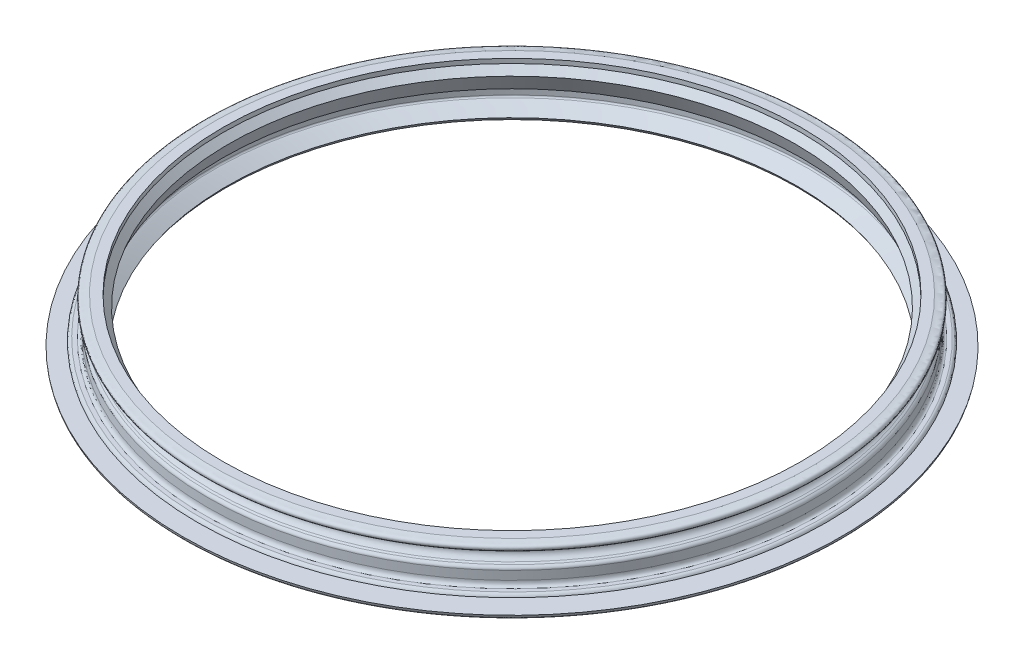
ISO-10303-21;
HEADER;
FILE_DESCRIPTION(('STEP AP214'),'2;1');
FILE_NAME('part.step','',(''),(''),'','','');
FILE_SCHEMA(('AUTOMOTIVE_DESIGN { 1 0 10303 214 1 1 1 1 }'));
ENDSEC;
DATA;
#1=APPLICATION_CONTEXT('core data for automotive mechanical design processes');
#2=APPLICATION_PROTOCOL_DEFINITION('international standard','automotive_design',2000,#1);
#3=PRODUCT_CONTEXT('',#1,'mechanical');
#4=PRODUCT('Part','Part','',(#3));
#5=PRODUCT_RELATED_PRODUCT_CATEGORY('part','',(#4));
#6=PRODUCT_DEFINITION_FORMATION('','',#4);
#7=PRODUCT_DEFINITION_CONTEXT('part definition',#1,'design');
#8=PRODUCT_DEFINITION('design','',#6,#7);
#9=PRODUCT_DEFINITION_SHAPE('','',#8);
#10=(LENGTH_UNIT() NAMED_UNIT(*) SI_UNIT(.MILLI.,.METRE.));
#11=(NAMED_UNIT(*) PLANE_ANGLE_UNIT() SI_UNIT($,.RADIAN.));
#12=(NAMED_UNIT(*) SI_UNIT($,.STERADIAN.) SOLID_ANGLE_UNIT());
#13=UNCERTAINTY_MEASURE_WITH_UNIT(LENGTH_MEASURE(1.E-05),#10,'distance_accuracy_value','');
#14=(GEOMETRIC_REPRESENTATION_CONTEXT(3) GLOBAL_UNCERTAINTY_ASSIGNED_CONTEXT((#13)) GLOBAL_UNIT_ASSIGNED_CONTEXT((#10,
#11,#12)) REPRESENTATION_CONTEXT('',''));
#15=CARTESIAN_POINT('',(0.,0.,0.));
#16=DIRECTION('',(0.,0.,1.));
#17=DIRECTION('',(1.,0.,0.));
#18=AXIS2_PLACEMENT_3D('',#15,#16,#17);
#19=CARTESIAN_POINT('',(3752.49268723425,4.51072546778732,0.));
#20=CARTESIAN_POINT('',(3752.37419765091,3.66628102334289,0.));
#21=CARTESIAN_POINT('',(3751.78899799814,3.66628102334289,0.));
#22=B_SPLINE_CURVE_WITH_KNOTS('',2,(#19,#20,#21),.UNSPECIFIED.,.F.,.F.,(3,3),(0.,1.),.UNSPECIFIED.);
#23=CARTESIAN_POINT('',(3679.46490945647,-23.0971340829524,0.));
#24=DIRECTION('',(0.,-1.,0.));
#25=AXIS1_PLACEMENT('',#23,#24);
#26=SURFACE_OF_REVOLUTION('',#22,#25);
#27=CARTESIAN_POINT('',(3679.46490945647,3.66628102334289,0.));
#28=DIRECTION('',(0.,-1.,0.));
#29=DIRECTION('',(0.,0.,-1.));
#30=AXIS2_PLACEMENT_3D('',#27,#28,#29);
#31=CIRCLE('',#30,72.3240885416665);
#32=CARTESIAN_POINT('',(3679.46490945647,3.66628102334289,-72.3240885416665));
#33=VERTEX_POINT('',#32);
#34=EDGE_CURVE('E111',#33,#33,#31,.T.);
#35=ORIENTED_EDGE('',*,*,#34,.F.);
#36=EDGE_LOOP('',(#35));
#37=FACE_BOUND('',#36,.T.);
#38=CARTESIAN_POINT('',(3679.46490945647,4.51072546778732,0.));
#39=DIRECTION('',(0.,-1.,0.));
#40=DIRECTION('',(0.,0.,-1.));
#41=AXIS2_PLACEMENT_3D('',#38,#39,#40);
#42=CIRCLE('',#41,73.0277777777775);
#43=CARTESIAN_POINT('',(3679.46490945647,4.51072546778732,-73.0277777777775));
#44=VERTEX_POINT('',#43);
#45=EDGE_CURVE('E10',#44,#44,#42,.T.);
#46=ORIENTED_EDGE('',*,*,#45,.T.);
#47=EDGE_LOOP('',(#46));
#48=FACE_BOUND('',#47,.T.);
#49=ADVANCED_FACE('F31',(#37,#48),#26,.T.);
#50=CARTESIAN_POINT('',(0.,4.51072546778732,0.));
#51=DIRECTION('',(0.,-1.,0.));
#52=DIRECTION('',(0.,0.,-1.));
#53=AXIS2_PLACEMENT_3D('',#50,#51,#52);
#54=PLANE('',#53);
#55=ORIENTED_EDGE('',*,*,#45,.F.);
#56=EDGE_LOOP('',(#55));
#57=FACE_BOUND('',#56,.T.);
#58=CARTESIAN_POINT('',(3679.46490945647,4.51072546778732,0.));
#59=DIRECTION('',(0.,-1.,0.));
#60=DIRECTION('',(0.,0.,-1.));
#61=AXIS2_PLACEMENT_3D('',#58,#59,#60);
#62=CIRCLE('',#61,67.4000000000001);
#63=CARTESIAN_POINT('',(3679.46490945647,4.51072546778732,-67.4000000000001));
#64=VERTEX_POINT('',#63);
#65=EDGE_CURVE('E38',#64,#64,#62,.T.);
#66=ORIENTED_EDGE('',*,*,#65,.T.);
#67=EDGE_LOOP('',(#66));
#68=FACE_BOUND('',#67,.T.);
#69=ADVANCED_FACE('F258',(#57,#68),#54,.F.);
#70=CARTESIAN_POINT('',(3679.46490945647,-23.0971340829524,0.));
#71=DIRECTION('',(0.,-1.,0.));
#72=DIRECTION('',(0.,0.,-1.));
#73=AXIS2_PLACEMENT_3D('',#70,#71,#72);
#74=CYLINDRICAL_SURFACE('',#73,67.4000000000001);
#75=CARTESIAN_POINT('',(3679.46490945647,5.4885032455652,0.));
#76=DIRECTION('',(0.,-1.,0.));
#77=DIRECTION('',(0.,0.,-1.));
#78=AXIS2_PLACEMENT_3D('',#75,#76,#77);
#79=CIRCLE('',#78,67.4000000000001);
#80=CARTESIAN_POINT('',(3679.46490945647,5.4885032455652,-67.4000000000001));
#81=VERTEX_POINT('',#80);
#82=EDGE_CURVE('E42',#81,#81,#79,.T.);
#83=ORIENTED_EDGE('',*,*,#82,.T.);
#84=EDGE_LOOP('',(#83));
#85=FACE_BOUND('',#84,.T.);
#86=ORIENTED_EDGE('',*,*,#65,.F.);
#87=EDGE_LOOP('',(#86));
#88=FACE_BOUND('',#87,.T.);
#89=ADVANCED_FACE('F255',(#85,#88),#74,.T.);
#90=CARTESIAN_POINT('',(3679.46490945647,5.51072546778732,0.));
#91=DIRECTION('',(0.,1.,0.));
#92=DIRECTION('',(0.,0.,1.));
#93=AXIS2_PLACEMENT_3D('',#90,#91,#92);
#94=CONICAL_SURFACE('',#93,69.6635193909252,1.56097908891554);
#95=ORIENTED_EDGE('',*,*,#82,.F.);
#96=EDGE_LOOP('',(#95));
#97=FACE_BOUND('',#96,.T.);
#98=CARTESIAN_POINT('',(3679.46490945647,5.51072546778732,0.));
#99=DIRECTION('',(0.,-1.,0.));
#100=DIRECTION('',(0.,0.,-1.));
#101=AXIS2_PLACEMENT_3D('',#98,#99,#100);
#102=CIRCLE('',#101,69.6635193909252);
#103=CARTESIAN_POINT('',(3679.46490945647,5.51072546778732,-69.6635193909252));
#104=VERTEX_POINT('',#103);
#105=EDGE_CURVE('E46',#104,#104,#102,.T.);
#106=ORIENTED_EDGE('',*,*,#105,.T.);
#107=EDGE_LOOP('',(#106));
#108=FACE_BOUND('',#107,.T.);
#109=ADVANCED_FACE('F239',(#97,#108),#94,.T.);
#110=CARTESIAN_POINT('',(3748.45924481962,6.13294769000936,0.));
#111=CARTESIAN_POINT('',(3748.81571183351,6.13294769000936,0.));
#112=CARTESIAN_POINT('',(3749.01597225017,5.82183657889823,0.));
#113=CARTESIAN_POINT('',(3749.12842884739,5.51072546778732,0.));
#114=B_SPLINE_CURVE_WITH_KNOTS('',3,(#110,#111,#112,#113),.UNSPECIFIED.,.F.,.F.,(4,4),(18.,19.),.UNSPECIFIED.);
#115=CARTESIAN_POINT('',(3679.46490945647,-23.0971340829524,0.));
#116=DIRECTION('',(0.,-1.,0.));
#117=AXIS1_PLACEMENT('',#115,#116);
#118=SURFACE_OF_REVOLUTION('',#114,#117);
#119=ORIENTED_EDGE('',*,*,#105,.F.);
#120=EDGE_LOOP('',(#119));
#121=FACE_BOUND('',#120,.T.);
#122=CARTESIAN_POINT('',(3679.46490945647,6.13294769000936,0.));
#123=DIRECTION('',(0.,-1.,0.));
#124=DIRECTION('',(0.,0.,-1.));
#125=AXIS2_PLACEMENT_3D('',#122,#123,#124);
#126=CIRCLE('',#125,68.9943353631475);
#127=CARTESIAN_POINT('',(3679.46490945647,6.13294769000936,-68.9943353631475));
#128=VERTEX_POINT('',#127);
#129=EDGE_CURVE('E51',#128,#128,#126,.T.);
#130=ORIENTED_EDGE('',*,*,#129,.T.);
#131=EDGE_LOOP('',(#130));
#132=FACE_BOUND('',#131,.T.);
#133=ADVANCED_FACE('F235',(#121,#132),#118,.T.);
#134=CARTESIAN_POINT('',(0.,6.13294769000936,0.));
#135=DIRECTION('',(0.,-1.,0.));
#136=DIRECTION('',(0.,0.,-1.));
#137=AXIS2_PLACEMENT_3D('',#134,#135,#136);
#138=PLANE('',#137);
#139=ORIENTED_EDGE('',*,*,#129,.F.);
#140=EDGE_LOOP('',(#139));
#141=FACE_BOUND('',#140,.T.);
#142=CARTESIAN_POINT('',(3679.46490945647,6.13294769000936,0.));
#143=DIRECTION('',(0.,-1.,0.));
#144=DIRECTION('',(0.,0.,-1.));
#145=AXIS2_PLACEMENT_3D('',#142,#143,#144);
#146=CIRCLE('',#145,68.1165575853697);
#147=CARTESIAN_POINT('',(3679.46490945647,6.13294769000936,-68.1165575853697));
#148=VERTEX_POINT('',#147);
#149=EDGE_CURVE('E54',#148,#148,#146,.T.);
#150=ORIENTED_EDGE('',*,*,#149,.T.);
#151=EDGE_LOOP('',(#150));
#152=FACE_BOUND('',#151,.T.);
#153=ADVANCED_FACE('F231',(#141,#152),#138,.F.);
#154=CARTESIAN_POINT('',(3746.86480037517,7.2329476900095,0.));
#155=CARTESIAN_POINT('',(3746.86480037517,6.21072546778714,0.));
#156=CARTESIAN_POINT('',(3747.58146704184,6.13294769000936,0.));
#157=B_SPLINE_CURVE_WITH_KNOTS('',2,(#154,#155,#156),.UNSPECIFIED.,.F.,.F.,(3,3),(16.,17.),.UNSPECIFIED.);
#158=CARTESIAN_POINT('',(3679.46490945647,-23.0971340829524,0.));
#159=DIRECTION('',(0.,-1.,0.));
#160=AXIS1_PLACEMENT('',#158,#159);
#161=SURFACE_OF_REVOLUTION('',#157,#160);
#162=ORIENTED_EDGE('',*,*,#149,.F.);
#163=EDGE_LOOP('',(#162));
#164=FACE_BOUND('',#163,.T.);
#165=CARTESIAN_POINT('',(3679.46490945647,7.2329476900095,0.));
#166=DIRECTION('',(0.,-1.,0.));
#167=DIRECTION('',(0.,0.,-1.));
#168=AXIS2_PLACEMENT_3D('',#165,#166,#167);
#169=CIRCLE('',#168,67.3998909187032);
#170=CARTESIAN_POINT('',(3679.46490945647,7.2329476900095,-67.3998909187032));
#171=VERTEX_POINT('',#170);
#172=EDGE_CURVE('E57',#171,#171,#169,.T.);
#173=ORIENTED_EDGE('',*,*,#172,.T.);
#174=EDGE_LOOP('',(#173));
#175=FACE_BOUND('',#174,.T.);
#176=ADVANCED_FACE('F227',(#164,#175),#161,.T.);
#177=CARTESIAN_POINT('',(3679.46490945647,-23.0971340829524,0.));
#178=DIRECTION('',(0.,-1.,0.));
#179=DIRECTION('',(0.,0.,-1.));
#180=AXIS2_PLACEMENT_3D('',#177,#178,#179);
#181=CYLINDRICAL_SURFACE('',#180,67.3998909187032);
#182=ORIENTED_EDGE('',*,*,#172,.F.);
#183=EDGE_LOOP('',(#182));
#184=FACE_BOUND('',#183,.T.);
#185=CARTESIAN_POINT('',(3679.46490945647,9.14405880112053,0.));
#186=DIRECTION('',(0.,-1.,0.));
#187=DIRECTION('',(0.,0.,-1.));
#188=AXIS2_PLACEMENT_3D('',#185,#186,#187);
#189=CIRCLE('',#188,67.3998909187032);
#190=CARTESIAN_POINT('',(3679.46490945647,9.14405880112053,-67.3998909187032));
#191=VERTEX_POINT('',#190);
#192=EDGE_CURVE('E60',#191,#191,#189,.T.);
#193=ORIENTED_EDGE('',*,*,#192,.T.);
#194=EDGE_LOOP('',(#193));
#195=FACE_BOUND('',#194,.T.);
#196=ADVANCED_FACE('F223',(#184,#195),#181,.T.);
#197=CARTESIAN_POINT('',(3746.36015627795,9.9108122733428,0.));
#198=CARTESIAN_POINT('',(3746.89722225017,9.58121157889832,0.));
#199=CARTESIAN_POINT('',(3746.86480037517,9.14405880112054,0.));
#200=B_SPLINE_CURVE_WITH_KNOTS('',2,(#197,#198,#199),.UNSPECIFIED.,.F.,.F.,(3,3),(14.,15.),.UNSPECIFIED.);
#201=CARTESIAN_POINT('',(3679.46490945647,-23.0971340829524,0.));
#202=DIRECTION('',(0.,-1.,0.));
#203=AXIS1_PLACEMENT('',#201,#202);
#204=SURFACE_OF_REVOLUTION('',#200,#203);
#205=ORIENTED_EDGE('',*,*,#192,.F.);
#206=EDGE_LOOP('',(#205));
#207=FACE_BOUND('',#206,.T.);
#208=CARTESIAN_POINT('',(3679.46490945647,9.9108122733428,0.));
#209=DIRECTION('',(0.,-1.,0.));
#210=DIRECTION('',(0.,0.,-1.));
#211=AXIS2_PLACEMENT_3D('',#208,#209,#210);
#212=CIRCLE('',#211,66.8952468214807);
#213=CARTESIAN_POINT('',(3679.46490945647,9.9108122733428,-66.8952468214807));
#214=VERTEX_POINT('',#213);
#215=EDGE_CURVE('E63',#214,#214,#212,.T.);
#216=ORIENTED_EDGE('',*,*,#215,.T.);
#217=EDGE_LOOP('',(#216));
#218=FACE_BOUND('',#217,.T.);
#219=ADVANCED_FACE('F220',(#207,#218),#204,.T.);
#220=CARTESIAN_POINT('',(3679.46490945647,7.70979538789805,0.));
#221=DIRECTION('',(0.,-1.,0.));
#222=DIRECTION('',(0.,0.,-1.));
#223=AXIS2_PLACEMENT_3D('',#220,#221,#222);
#224=TOROIDAL_SURFACE('',#223,65.4380113863073,2.63969893047254);
#225=ORIENTED_EDGE('',*,*,#215,.F.);
#226=EDGE_LOOP('',(#225));
#227=FACE_BOUND('',#226,.T.);
#228=CARTESIAN_POINT('',(3679.46490945647,10.1357254677873,0.));
#229=DIRECTION('',(0.,-1.,0.));
#230=DIRECTION('',(0.,0.,-1.));
#231=AXIS2_PLACEMENT_3D('',#228,#229,#230);
#232=CIRCLE('',#231,66.4786235575923);
#233=CARTESIAN_POINT('',(3679.46490945647,10.1357254677873,-66.4786235575923));
#234=VERTEX_POINT('',#233);
#235=EDGE_CURVE('E66',#234,#234,#232,.T.);
#236=ORIENTED_EDGE('',*,*,#235,.T.);
#237=EDGE_LOOP('',(#236));
#238=FACE_BOUND('',#237,.T.);
#239=ADVANCED_FACE('F199',(#227,#238),#224,.T.);
#240=CARTESIAN_POINT('',(3746.96354169462,13.0580344955649,0.));
#241=CARTESIAN_POINT('',(3746.83797745851,13.090846995565,0.));
#242=CARTESIAN_POINT('',(3746.70620662517,13.1077306761206,0.));
#243=CARTESIAN_POINT('',(3746.57035593073,13.1077306761206,0.));
#244=CARTESIAN_POINT('',(3745.71332468073,13.1077306761206,0.));
#245=CARTESIAN_POINT('',(3745.01848961128,12.4125483844539,0.));
#246=CARTESIAN_POINT('',(3745.01848961128,11.5556039400094,0.));
#247=CARTESIAN_POINT('',(3745.01848961128,10.9216195650095,0.));
#248=CARTESIAN_POINT('',(3745.39874134739,10.3765240788982,0.));
#249=CARTESIAN_POINT('',(3745.94353301406,10.1357254677873,0.));
#250=B_SPLINE_CURVE_WITH_KNOTS('',3,(#240,#241,#242,#243,#244,#245,#246,#247,#248,#249),
.UNSPECIFIED.,.F.,.F.,(4,3,3,4),(10.,11.,12.,13.),.UNSPECIFIED.);
#251=CARTESIAN_POINT('',(3679.46490945647,-23.0971340829524,0.));
#252=DIRECTION('',(0.,-1.,0.));
#253=AXIS1_PLACEMENT('',#251,#252);
#254=SURFACE_OF_REVOLUTION('',#250,#253);
#255=ORIENTED_EDGE('',*,*,#235,.F.);
#256=EDGE_LOOP('',(#255));
#257=FACE_BOUND('',#256,.T.);
#258=CARTESIAN_POINT('',(3679.46490945647,13.0580344955649,0.));
#259=DIRECTION('',(0.,-1.,0.));
#260=DIRECTION('',(0.,0.,-1.));
#261=AXIS2_PLACEMENT_3D('',#258,#259,#260);
#262=CIRCLE('',#261,67.4986322381472);
#263=CARTESIAN_POINT('',(3679.46490945647,13.0580344955649,-67.4986322381472));
#264=VERTEX_POINT('',#263);
#265=EDGE_CURVE('E69',#264,#264,#262,.T.);
#266=ORIENTED_EDGE('',*,*,#265,.T.);
#267=EDGE_LOOP('',(#266));
#268=FACE_BOUND('',#267,.T.);
#269=ADVANCED_FACE('F195',(#257,#268),#254,.T.);
#270=CARTESIAN_POINT('',(3745.67404516684,14.4440588011205,0.));
#271=CARTESIAN_POINT('',(3746.23702259739,14.3107254677873,0.));
#272=CARTESIAN_POINT('',(3746.59995662517,14.2718365788983,0.));
#273=CARTESIAN_POINT('',(3746.92217884739,14.2718365788983,0.));
#274=CARTESIAN_POINT('',(3747.34440106962,14.2718365788983,0.));
#275=CARTESIAN_POINT('',(3747.51480037517,13.9135466483428,0.));
#276=CARTESIAN_POINT('',(3747.51480037517,13.7301699122318,0.));
#277=CARTESIAN_POINT('',(3747.51480037517,13.1447966483429,0.));
#278=CARTESIAN_POINT('',(3747.07677954184,13.0678001205649,0.));
#279=CARTESIAN_POINT('',(3746.96354169462,13.0580344955649,0.));
#280=B_SPLINE_CURVE_WITH_KNOTS('',3,(#270,#271,#272,#273,#274,#275,#276,#277,#278,#279),
.UNSPECIFIED.,.F.,.F.,(4,3,3,4),(7.,8.,9.,10.),.UNSPECIFIED.);
#281=CARTESIAN_POINT('',(3679.46490945647,-23.0971340829524,0.));
#282=DIRECTION('',(0.,-1.,0.));
#283=AXIS1_PLACEMENT('',#281,#282);
#284=SURFACE_OF_REVOLUTION('',#280,#283);
#285=ORIENTED_EDGE('',*,*,#265,.F.);
#286=EDGE_LOOP('',(#285));
#287=FACE_BOUND('',#286,.T.);
#288=CARTESIAN_POINT('',(3679.46490945647,14.4440588011205,0.));
#289=DIRECTION('',(0.,-1.,0.));
#290=DIRECTION('',(0.,0.,-1.));
#291=AXIS2_PLACEMENT_3D('',#288,#289,#290);
#292=CIRCLE('',#291,66.2091357103694);
#293=CARTESIAN_POINT('',(3679.46490945647,14.4440588011205,-66.2091357103694));
#294=VERTEX_POINT('',#293);
#295=EDGE_CURVE('E72',#294,#294,#292,.T.);
#296=ORIENTED_EDGE('',*,*,#295,.T.);
#297=EDGE_LOOP('',(#296));
#298=FACE_BOUND('',#297,.T.);
#299=ADVANCED_FACE('F191',(#287,#298),#284,.T.);
#300=CARTESIAN_POINT('',(0.,14.4440588011205,0.));
#301=DIRECTION('',(0.,-1.,0.));
#302=DIRECTION('',(0.,0.,-1.));
#303=AXIS2_PLACEMENT_3D('',#300,#301,#302);
#304=PLANE('',#303);
#305=ORIENTED_EDGE('',*,*,#295,.F.);
#306=EDGE_LOOP('',(#305));
#307=FACE_BOUND('',#306,.T.);
#308=CARTESIAN_POINT('',(3679.46490945647,14.4440588011205,0.));
#309=DIRECTION('',(0.,-1.,0.));
#310=DIRECTION('',(0.,0.,-1.));
#311=AXIS2_PLACEMENT_3D('',#308,#309,#310);
#312=CIRCLE('',#311,64.0916666666662);
#313=CARTESIAN_POINT('',(3679.46490945647,14.4440588011205,-64.0916666666662));
#314=VERTEX_POINT('',#313);
#315=EDGE_CURVE('E75',#314,#314,#312,.T.);
#316=ORIENTED_EDGE('',*,*,#315,.T.);
#317=EDGE_LOOP('',(#316));
#318=FACE_BOUND('',#317,.T.);
#319=ADVANCED_FACE('F187',(#307,#318),#304,.F.);
#320=CARTESIAN_POINT('',(3679.46490945647,-23.0971340829524,0.));
#321=DIRECTION('',(0.,-1.,0.));
#322=DIRECTION('',(0.,0.,-1.));
#323=AXIS2_PLACEMENT_3D('',#320,#321,#322);
#324=CYLINDRICAL_SURFACE('',#323,64.091666666666);
#325=ORIENTED_EDGE('',*,*,#315,.F.);
#326=EDGE_LOOP('',(#325));
#327=FACE_BOUND('',#326,.T.);
#328=CARTESIAN_POINT('',(3679.46490945647,13.4551699122316,0.));
#329=DIRECTION('',(0.,-1.,0.));
#330=DIRECTION('',(0.,0.,-1.));
#331=AXIS2_PLACEMENT_3D('',#328,#329,#330);
#332=CIRCLE('',#331,64.0916666666658);
#333=CARTESIAN_POINT('',(3679.46490945647,13.4551699122316,-64.0916666666658));
#334=VERTEX_POINT('',#333);
#335=EDGE_CURVE('E78',#334,#334,#332,.T.);
#336=ORIENTED_EDGE('',*,*,#335,.T.);
#337=EDGE_LOOP('',(#336));
#338=FACE_BOUND('',#337,.T.);
#339=ADVANCED_FACE('F183',(#327,#338),#324,.F.);
#340=CARTESIAN_POINT('',(3679.46490945647,11.9718365788981,0.));
#341=DIRECTION('',(0.,1.,0.));
#342=DIRECTION('',(0.,0.,1.));
#343=AXIS2_PLACEMENT_3D('',#340,#341,#342);
#344=CONICAL_SURFACE('',#343,62.7500000000008,0.735292643944842);
#345=ORIENTED_EDGE('',*,*,#335,.F.);
#346=EDGE_LOOP('',(#345));
#347=FACE_BOUND('',#346,.T.);
#348=CARTESIAN_POINT('',(3679.46490945647,11.9718365788981,0.));
#349=DIRECTION('',(0.,-1.,0.));
#350=DIRECTION('',(0.,0.,-1.));
#351=AXIS2_PLACEMENT_3D('',#348,#349,#350);
#352=CIRCLE('',#351,62.7500000000008);
#353=CARTESIAN_POINT('',(3679.46490945647,11.9718365788981,-62.7500000000008));
#354=VERTEX_POINT('',#353);
#355=EDGE_CURVE('E81',#354,#354,#352,.T.);
#356=ORIENTED_EDGE('',*,*,#355,.T.);
#357=EDGE_LOOP('',(#356));
#358=FACE_BOUND('',#357,.T.);
#359=ADVANCED_FACE('F179',(#347,#358),#344,.F.);
#360=CARTESIAN_POINT('',(3679.46490945647,8.57739213445394,0.));
#361=DIRECTION('',(0.,-1.,0.));
#362=DIRECTION('',(0.,0.,-1.));
#363=AXIS2_PLACEMENT_3D('',#360,#361,#362);
#364=CONICAL_SURFACE('',#363,64.1416666666661,0.389083219663714);
#365=ORIENTED_EDGE('',*,*,#355,.F.);
#366=EDGE_LOOP('',(#365));
#367=FACE_BOUND('',#366,.T.);
#368=CARTESIAN_POINT('',(3679.46490945647,8.57739213445394,0.));
#369=DIRECTION('',(0.,-1.,0.));
#370=DIRECTION('',(0.,0.,-1.));
#371=AXIS2_PLACEMENT_3D('',#368,#369,#370);
#372=CIRCLE('',#371,64.1416666666661);
#373=CARTESIAN_POINT('',(3679.46490945647,8.57739213445394,-64.1416666666661));
#374=VERTEX_POINT('',#373);
#375=EDGE_CURVE('E84',#374,#374,#372,.T.);
#376=ORIENTED_EDGE('',*,*,#375,.T.);
#377=EDGE_LOOP('',(#376));
#378=FACE_BOUND('',#377,.T.);
#379=ADVANCED_FACE('F175',(#367,#378),#364,.F.);
#380=CARTESIAN_POINT('',(0.,8.57739213445394,0.));
#381=DIRECTION('',(0.,1.,0.));
#382=DIRECTION('',(0.,0.,1.));
#383=AXIS2_PLACEMENT_3D('',#380,#381,#382);
#384=PLANE('',#383);
#385=ORIENTED_EDGE('',*,*,#375,.F.);
#386=EDGE_LOOP('',(#385));
#387=FACE_BOUND('',#386,.T.);
#388=CARTESIAN_POINT('',(3679.46490945647,8.57739213445394,0.));
#389=DIRECTION('',(0.,-1.,0.));
#390=DIRECTION('',(0.,0.,-1.));
#391=AXIS2_PLACEMENT_3D('',#388,#389,#390);
#392=CIRCLE('',#391,65.2527777777774);
#393=CARTESIAN_POINT('',(3679.46490945647,8.57739213445394,-65.2527777777774));
#394=VERTEX_POINT('',#393);
#395=EDGE_CURVE('E87',#394,#394,#392,.T.);
#396=ORIENTED_EDGE('',*,*,#395,.T.);
#397=EDGE_LOOP('',(#396));
#398=FACE_BOUND('',#397,.T.);
#399=ADVANCED_FACE('F171',(#387,#398),#384,.F.);
#400=CARTESIAN_POINT('',(3745.46768723425,7.41072546778719,0.));
#401=CARTESIAN_POINT('',(3745.46768723425,7.73663692612059,0.));
#402=CARTESIAN_POINT('',(3744.71768723425,8.57739213445394,0.));
#403=B_SPLINE_CURVE_WITH_KNOTS('',2,(#400,#401,#402),.UNSPECIFIED.,.F.,.F.,(3,3),(1.,2.),.UNSPECIFIED.);
#404=CARTESIAN_POINT('',(3679.46490945647,-23.0971340829524,0.));
#405=DIRECTION('',(0.,-1.,0.));
#406=AXIS1_PLACEMENT('',#404,#405);
#407=SURFACE_OF_REVOLUTION('',#403,#406);
#408=ORIENTED_EDGE('',*,*,#395,.F.);
#409=EDGE_LOOP('',(#408));
#410=FACE_BOUND('',#409,.T.);
#411=CARTESIAN_POINT('',(3679.46490945647,7.41072546778719,0.));
#412=DIRECTION('',(0.,-1.,0.));
#413=DIRECTION('',(0.,0.,-1.));
#414=AXIS2_PLACEMENT_3D('',#411,#412,#413);
#415=CIRCLE('',#414,66.0027777777774);
#416=CARTESIAN_POINT('',(3679.46490945647,7.41072546778719,-66.0027777777774));
#417=VERTEX_POINT('',#416);
#418=EDGE_CURVE('E90',#417,#417,#415,.T.);
#419=ORIENTED_EDGE('',*,*,#418,.T.);
#420=EDGE_LOOP('',(#419));
#421=FACE_BOUND('',#420,.T.);
#422=ADVANCED_FACE('F168',(#410,#421),#407,.T.);
#423=CARTESIAN_POINT('',(3679.46490945647,-23.0971340829524,0.));
#424=DIRECTION('',(0.,-1.,0.));
#425=DIRECTION('',(0.,0.,-1.));
#426=AXIS2_PLACEMENT_3D('',#423,#424,#425);
#427=CYLINDRICAL_SURFACE('',#426,66.0027777777774);
#428=ORIENTED_EDGE('',*,*,#418,.F.);
#429=EDGE_LOOP('',(#428));
#430=FACE_BOUND('',#429,.T.);
#431=CARTESIAN_POINT('',(3679.46490945647,6.07739213445394,0.));
#432=DIRECTION('',(0.,-1.,0.));
#433=DIRECTION('',(0.,0.,-1.));
#434=AXIS2_PLACEMENT_3D('',#431,#432,#433);
#435=CIRCLE('',#434,66.0027777777774);
#436=CARTESIAN_POINT('',(3679.46490945647,6.07739213445394,-66.0027777777774));
#437=VERTEX_POINT('',#436);
#438=EDGE_CURVE('E93',#437,#437,#435,.T.);
#439=ORIENTED_EDGE('',*,*,#438,.T.);
#440=EDGE_LOOP('',(#439));
#441=FACE_BOUND('',#440,.T.);
#442=ADVANCED_FACE('F147',(#430,#441),#427,.F.);
#443=CARTESIAN_POINT('',(3745.23344244258,5.69288692612054,0.));
#444=CARTESIAN_POINT('',(3745.48530876202,5.84102060667602,0.));
#445=CARTESIAN_POINT('',(3745.46768723425,6.07739213445394,0.));
#446=B_SPLINE_CURVE_WITH_KNOTS('',2,(#443,#444,#445),.UNSPECIFIED.,.F.,.F.,(3,3),(30.,31.),.UNSPECIFIED.);
#447=CARTESIAN_POINT('',(3679.46490945647,-23.0971340829524,0.));
#448=DIRECTION('',(0.,-1.,0.));
#449=AXIS1_PLACEMENT('',#447,#448);
#450=SURFACE_OF_REVOLUTION('',#446,#449);
#451=ORIENTED_EDGE('',*,*,#438,.F.);
#452=EDGE_LOOP('',(#451));
#453=FACE_BOUND('',#452,.T.);
#454=CARTESIAN_POINT('',(3679.46490945647,5.69288692612054,0.));
#455=DIRECTION('',(0.,-1.,0.));
#456=DIRECTION('',(0.,0.,-1.));
#457=AXIS2_PLACEMENT_3D('',#454,#455,#456);
#458=CIRCLE('',#457,65.7685329861106);
#459=CARTESIAN_POINT('',(3679.46490945647,5.69288692612054,-65.7685329861106));
#460=VERTEX_POINT('',#459);
#461=EDGE_CURVE('E96',#460,#460,#458,.T.);
#462=ORIENTED_EDGE('',*,*,#461,.T.);
#463=EDGE_LOOP('',(#462));
#464=FACE_BOUND('',#463,.T.);
#465=ADVANCED_FACE('F143',(#453,#464),#450,.T.);
#466=CARTESIAN_POINT('',(3742.56213167869,3.7565588011205,0.));
#467=CARTESIAN_POINT('',(3744.98157612314,5.54475324556507,0.));
#468=CARTESIAN_POINT('',(3745.23344244258,5.69288692612054,0.));
#469=B_SPLINE_CURVE_WITH_KNOTS('',2,(#466,#467,#468),.UNSPECIFIED.,.F.,.F.,(3,3),(29.,30.),.UNSPECIFIED.);
#470=CARTESIAN_POINT('',(3679.46490945647,-23.0971340829524,0.));
#471=DIRECTION('',(0.,-1.,0.));
#472=AXIS1_PLACEMENT('',#470,#471);
#473=SURFACE_OF_REVOLUTION('',#469,#472);
#474=ORIENTED_EDGE('',*,*,#461,.F.);
#475=EDGE_LOOP('',(#474));
#476=FACE_BOUND('',#475,.T.);
#477=CARTESIAN_POINT('',(3679.46490945647,3.75655880112058,0.));
#478=DIRECTION('',(0.,-1.,0.));
#479=DIRECTION('',(0.,0.,-1.));
#480=AXIS2_PLACEMENT_3D('',#477,#478,#479);
#481=CIRCLE('',#480,63.0972222222215);
#482=CARTESIAN_POINT('',(3679.46490945647,3.75655880112058,-63.0972222222215));
#483=VERTEX_POINT('',#482);
#484=EDGE_CURVE('E99',#483,#483,#481,.T.);
#485=ORIENTED_EDGE('',*,*,#484,.T.);
#486=EDGE_LOOP('',(#485));
#487=FACE_BOUND('',#486,.T.);
#488=ADVANCED_FACE('F139',(#476,#487),#473,.T.);
#489=CARTESIAN_POINT('',(3679.46490945647,3.08016991223181,0.));
#490=DIRECTION('',(0.,-1.,0.));
#491=DIRECTION('',(0.,0.,-1.));
#492=AXIS2_PLACEMENT_3D('',#489,#490,#491);
#493=CONICAL_SURFACE('',#492,63.5416666666657,0.581339208594803);
#494=ORIENTED_EDGE('',*,*,#484,.F.);
#495=EDGE_LOOP('',(#494));
#496=FACE_BOUND('',#495,.T.);
#497=CARTESIAN_POINT('',(3679.46490945647,3.08016991223181,0.));
#498=DIRECTION('',(0.,-1.,0.));
#499=DIRECTION('',(0.,0.,-1.));
#500=AXIS2_PLACEMENT_3D('',#497,#498,#499);
#501=CIRCLE('',#500,63.5416666666657);
#502=CARTESIAN_POINT('',(3679.46490945647,3.08016991223181,-63.5416666666657));
#503=VERTEX_POINT('',#502);
#504=EDGE_CURVE('E102',#503,#503,#501,.T.);
#505=ORIENTED_EDGE('',*,*,#504,.T.);
#506=EDGE_LOOP('',(#505));
#507=FACE_BOUND('',#506,.T.);
#508=ADVANCED_FACE('F135',(#496,#507),#493,.F.);
#509=CARTESIAN_POINT('',(3679.46490945647,3.91628102334352,0.));
#510=DIRECTION('',(0.,1.,0.));
#511=DIRECTION('',(0.,0.,1.));
#512=AXIS2_PLACEMENT_3D('',#509,#510,#511);
#513=CONICAL_SURFACE('',#512,65.1861111111112,1.10041481284593);
#514=ORIENTED_EDGE('',*,*,#504,.F.);
#515=EDGE_LOOP('',(#514));
#516=FACE_BOUND('',#515,.T.);
#517=CARTESIAN_POINT('',(3679.46490945647,3.91628102334352,0.));
#518=DIRECTION('',(0.,-1.,0.));
#519=DIRECTION('',(0.,0.,-1.));
#520=AXIS2_PLACEMENT_3D('',#517,#518,#519);
#521=CIRCLE('',#520,65.1861111111112);
#522=CARTESIAN_POINT('',(3679.46490945647,3.91628102334352,-65.1861111111112));
#523=VERTEX_POINT('',#522);
#524=EDGE_CURVE('E105',#523,#523,#521,.T.);
#525=ORIENTED_EDGE('',*,*,#524,.T.);
#526=EDGE_LOOP('',(#525));
#527=FACE_BOUND('',#526,.T.);
#528=ADVANCED_FACE('F131',(#516,#527),#513,.T.);
#529=CARTESIAN_POINT('',(3745.90102056758,3.68850324556502,0.));
#530=CARTESIAN_POINT('',(3745.2732427898,4.31072546778728,0.));
#531=CARTESIAN_POINT('',(3744.65102056758,3.9162810233429,0.));
#532=B_SPLINE_CURVE_WITH_KNOTS('',2,(#529,#530,#531),.UNSPECIFIED.,.F.,.F.,(3,3),(26.,27.),.UNSPECIFIED.);
#533=CARTESIAN_POINT('',(3679.46490945647,-23.0971340829524,0.));
#534=DIRECTION('',(0.,-1.,0.));
#535=AXIS1_PLACEMENT('',#533,#534);
#536=SURFACE_OF_REVOLUTION('',#532,#535);
#537=ORIENTED_EDGE('',*,*,#524,.F.);
#538=EDGE_LOOP('',(#537));
#539=FACE_BOUND('',#538,.T.);
#540=CARTESIAN_POINT('',(3679.46490945647,3.68850324556503,0.));
#541=DIRECTION('',(0.,-1.,0.));
#542=DIRECTION('',(0.,0.,-1.));
#543=AXIS2_PLACEMENT_3D('',#540,#541,#542);
#544=CIRCLE('',#543,66.4361111111109);
#545=CARTESIAN_POINT('',(3679.46490945647,3.68850324556503,-66.4361111111109));
#546=VERTEX_POINT('',#545);
#547=EDGE_CURVE('E108',#546,#546,#544,.T.);
#548=ORIENTED_EDGE('',*,*,#547,.T.);
#549=EDGE_LOOP('',(#548));
#550=FACE_BOUND('',#549,.T.);
#551=ADVANCED_FACE('F126',(#539,#550),#536,.T.);
#552=CARTESIAN_POINT('',(3679.46490945647,3.68850324556503,0.));
#553=DIRECTION('',(0.,-1.,0.));
#554=DIRECTION('',(0.,0.,-1.));
#555=AXIS2_PLACEMENT_3D('',#552,#553,#554);
#556=CONICAL_SURFACE('',#555,66.4361111111109,1.56702217565872);
#557=ORIENTED_EDGE('',*,*,#34,.T.);
#558=EDGE_LOOP('',(#557));
#559=FACE_BOUND('',#558,.T.);
#560=ORIENTED_EDGE('',*,*,#547,.F.);
#561=EDGE_LOOP('',(#560));
#562=FACE_BOUND('',#561,.T.);
#563=ADVANCED_FACE('F130',(#559,#562),#556,.F.);
#564=CLOSED_SHELL('',(#49,#69,#89,#109,#133,#153,#176,#196,#219,#239,#269,#299,#319,#339,#359,
#379,#399,#422,#442,#465,#488,#508,#528,#551,#563));
#565=MANIFOLD_SOLID_BREP('B2',#564);
#566=ADVANCED_BREP_SHAPE_REPRESENTATION('',(#18,#565),#14);
#567=SHAPE_DEFINITION_REPRESENTATION(#9,#566);
ENDSEC;
END-ISO-10303-21;
